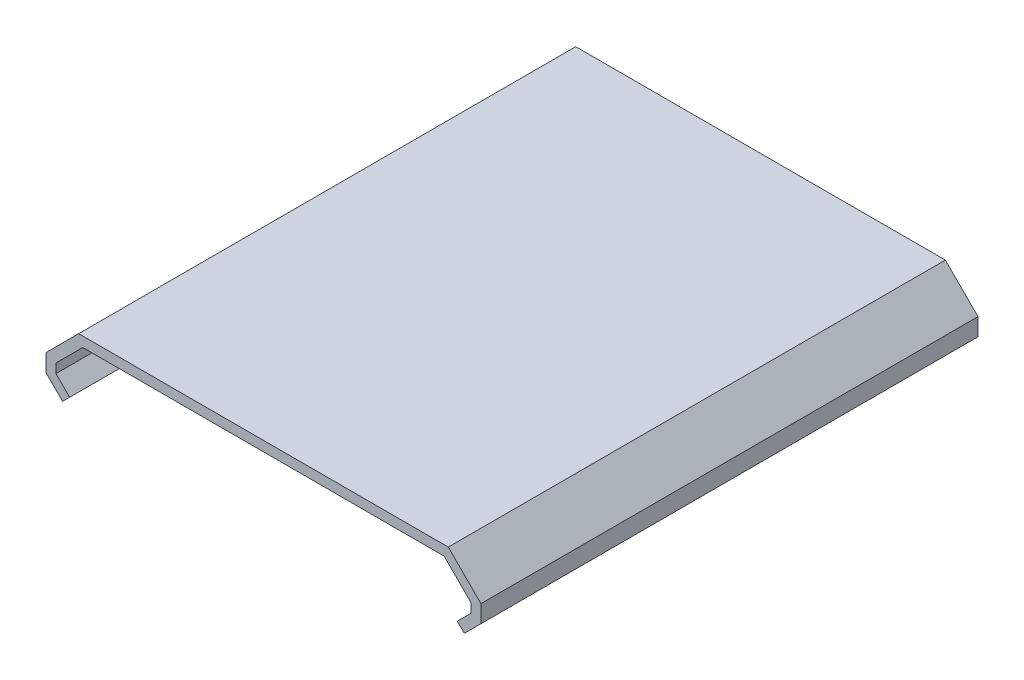
ISO-10303-21;
HEADER;
FILE_DESCRIPTION(('STEP AP214'),'2;1');
FILE_NAME('part.step','',(''),(''),'','','');
FILE_SCHEMA(('AUTOMOTIVE_DESIGN { 1 0 10303 214 1 1 1 1 }'));
ENDSEC;
DATA;
#1=APPLICATION_CONTEXT('core data for automotive mechanical design processes');
#2=APPLICATION_PROTOCOL_DEFINITION('international standard','automotive_design',2000,#1);
#3=PRODUCT_CONTEXT('',#1,'mechanical');
#4=PRODUCT('Part','Part','',(#3));
#5=PRODUCT_RELATED_PRODUCT_CATEGORY('part','',(#4));
#6=PRODUCT_DEFINITION_FORMATION('','',#4);
#7=PRODUCT_DEFINITION_CONTEXT('part definition',#1,'design');
#8=PRODUCT_DEFINITION('design','',#6,#7);
#9=PRODUCT_DEFINITION_SHAPE('','',#8);
#10=(LENGTH_UNIT() NAMED_UNIT(*) SI_UNIT(.MILLI.,.METRE.));
#11=(NAMED_UNIT(*) PLANE_ANGLE_UNIT() SI_UNIT($,.RADIAN.));
#12=(NAMED_UNIT(*) SI_UNIT($,.STERADIAN.) SOLID_ANGLE_UNIT());
#13=UNCERTAINTY_MEASURE_WITH_UNIT(LENGTH_MEASURE(1.E-05),#10,'distance_accuracy_value','');
#14=(GEOMETRIC_REPRESENTATION_CONTEXT(3) GLOBAL_UNCERTAINTY_ASSIGNED_CONTEXT((#13)) GLOBAL_UNIT_ASSIGNED_CONTEXT((#10,
#11,#12)) REPRESENTATION_CONTEXT('',''));
#15=CARTESIAN_POINT('',(0.,0.,0.));
#16=DIRECTION('',(0.,0.,1.));
#17=DIRECTION('',(1.,0.,0.));
#18=AXIS2_PLACEMENT_3D('',#15,#16,#17);
#19=CARTESIAN_POINT('',(83.5,37.5,-200.));
#20=DIRECTION('',(-0.707106781186548,0.707106781186548,0.));
#21=DIRECTION('',(-0.707106781186548,-0.707106781186548,0.));
#22=AXIS2_PLACEMENT_3D('',#19,#20,#21);
#23=PLANE('',#22);
#24=DIRECTION('',(-0.707106781186548,-0.707106781186548,0.));
#25=VECTOR('',#24,1.);
#26=CARTESIAN_POINT('',(83.5,37.5,0.));
#27=LINE('',#26,#25);
#28=CARTESIAN_POINT('',(83.5,37.5,0.));
#29=VERTEX_POINT('',#28);
#30=CARTESIAN_POINT('',(78.,32.,0.));
#31=VERTEX_POINT('',#30);
#32=EDGE_CURVE('E196',#29,#31,#27,.T.);
#33=ORIENTED_EDGE('',*,*,#32,.F.);
#34=DIRECTION('',(0.,0.,1.));
#35=VECTOR('',#34,1.);
#36=CARTESIAN_POINT('',(83.5,37.5,-200.));
#37=LINE('',#36,#35);
#38=CARTESIAN_POINT('',(83.5,37.5,-200.));
#39=VERTEX_POINT('',#38);
#40=EDGE_CURVE('E11',#39,#29,#37,.T.);
#41=ORIENTED_EDGE('',*,*,#40,.F.);
#42=DIRECTION('',(-0.707106781186548,-0.707106781186548,0.));
#43=VECTOR('',#42,1.);
#44=CARTESIAN_POINT('',(83.5,37.5,-200.));
#45=LINE('',#44,#43);
#46=CARTESIAN_POINT('',(78.,32.,-200.));
#47=VERTEX_POINT('',#46);
#48=EDGE_CURVE('E198',#39,#47,#45,.T.);
#49=ORIENTED_EDGE('',*,*,#48,.T.);
#50=DIRECTION('',(0.,0.,1.));
#51=VECTOR('',#50,1.);
#52=CARTESIAN_POINT('',(78.,32.,-200.));
#53=LINE('',#52,#51);
#54=EDGE_CURVE('E44',#47,#31,#53,.T.);
#55=ORIENTED_EDGE('',*,*,#54,.T.);
#56=EDGE_LOOP('',(#33,#41,#49,#55));
#57=FACE_BOUND('',#56,.T.);
#58=ADVANCED_FACE('F41',(#57),#23,.T.);
#59=CARTESIAN_POINT('',(83.5,41.2071067811866,-200.));
#60=DIRECTION('',(-1.,0.,0.));
#61=DIRECTION('',(0.,0.,1.));
#62=AXIS2_PLACEMENT_3D('',#59,#60,#61);
#63=PLANE('',#62);
#64=DIRECTION('',(0.,-1.,0.));
#65=VECTOR('',#64,1.);
#66=CARTESIAN_POINT('',(83.5,41.2071067811866,0.));
#67=LINE('',#66,#65);
#68=CARTESIAN_POINT('',(83.5,41.2071067811866,0.));
#69=VERTEX_POINT('',#68);
#70=EDGE_CURVE('E202',#69,#29,#67,.T.);
#71=ORIENTED_EDGE('',*,*,#70,.F.);
#72=DIRECTION('',(0.,0.,1.));
#73=VECTOR('',#72,1.);
#74=CARTESIAN_POINT('',(83.5,41.2071067811866,-200.));
#75=LINE('',#74,#73);
#76=CARTESIAN_POINT('',(83.5,41.2071067811866,-200.));
#77=VERTEX_POINT('',#76);
#78=EDGE_CURVE('E49',#77,#69,#75,.T.);
#79=ORIENTED_EDGE('',*,*,#78,.F.);
#80=DIRECTION('',(0.,-1.,0.));
#81=VECTOR('',#80,1.);
#82=CARTESIAN_POINT('',(83.5,41.2071067811866,-200.));
#83=LINE('',#82,#81);
#84=EDGE_CURVE('E235',#77,#39,#83,.T.);
#85=ORIENTED_EDGE('',*,*,#84,.T.);
#86=ORIENTED_EDGE('',*,*,#40,.T.);
#87=EDGE_LOOP('',(#71,#79,#85,#86));
#88=FACE_BOUND('',#87,.T.);
#89=ADVANCED_FACE('F324',(#88),#63,.T.);
#90=CARTESIAN_POINT('',(72.7071067811865,52.,-200.));
#91=DIRECTION('',(-0.707106781186547,-0.707106781186548,0.));
#92=DIRECTION('',(0.707106781186548,-0.707106781186547,0.));
#93=AXIS2_PLACEMENT_3D('',#90,#91,#92);
#94=PLANE('',#93);
#95=DIRECTION('',(0.707106781186548,-0.707106781186547,0.));
#96=VECTOR('',#95,1.);
#97=CARTESIAN_POINT('',(72.7071067811865,52.,0.));
#98=LINE('',#97,#96);
#99=CARTESIAN_POINT('',(72.7071067811865,52.,0.));
#100=VERTEX_POINT('',#99);
#101=EDGE_CURVE('E271',#100,#69,#98,.T.);
#102=ORIENTED_EDGE('',*,*,#101,.F.);
#103=DIRECTION('',(0.,0.,1.));
#104=VECTOR('',#103,1.);
#105=CARTESIAN_POINT('',(72.7071067811865,52.,-200.));
#106=LINE('',#105,#104);
#107=CARTESIAN_POINT('',(72.7071067811865,52.,-200.));
#108=VERTEX_POINT('',#107);
#109=EDGE_CURVE('E277',#108,#100,#106,.T.);
#110=ORIENTED_EDGE('',*,*,#109,.F.);
#111=DIRECTION('',(0.707106781186548,-0.707106781186547,0.));
#112=VECTOR('',#111,1.);
#113=CARTESIAN_POINT('',(72.7071067811865,52.,-200.));
#114=LINE('',#113,#112);
#115=EDGE_CURVE('E232',#108,#77,#114,.T.);
#116=ORIENTED_EDGE('',*,*,#115,.T.);
#117=ORIENTED_EDGE('',*,*,#78,.T.);
#118=EDGE_LOOP('',(#102,#110,#116,#117));
#119=FACE_BOUND('',#118,.T.);
#120=ADVANCED_FACE('F383',(#119),#94,.T.);
#121=CARTESIAN_POINT('',(72.7071067811865,52.,-200.));
#122=DIRECTION('',(0.,-1.,0.));
#123=DIRECTION('',(0.,0.,-1.));
#124=AXIS2_PLACEMENT_3D('',#121,#122,#123);
#125=PLANE('',#124);
#126=DIRECTION('',(0.,0.,-1.));
#127=VECTOR('',#126,1.);
#128=CARTESIAN_POINT('',(7.98994949366114,52.,-183.));
#129=LINE('',#128,#127);
#130=CARTESIAN_POINT('',(7.98994949366114,52.,-183.));
#131=VERTEX_POINT('',#130);
#132=CARTESIAN_POINT('',(7.98994949366114,52.,-200.));
#133=VERTEX_POINT('',#132);
#134=EDGE_CURVE('E188',#131,#133,#129,.T.);
#135=ORIENTED_EDGE('',*,*,#134,.T.);
#136=DIRECTION('',(1.,0.,0.));
#137=VECTOR('',#136,1.);
#138=CARTESIAN_POINT('',(72.7071067811865,52.,-200.));
#139=LINE('',#138,#137);
#140=EDGE_CURVE('E229',#133,#108,#139,.T.);
#141=ORIENTED_EDGE('',*,*,#140,.T.);
#142=ORIENTED_EDGE('',*,*,#109,.T.);
#143=DIRECTION('',(1.,0.,0.));
#144=VECTOR('',#143,1.);
#145=CARTESIAN_POINT('',(72.7071067811865,52.,0.));
#146=LINE('',#145,#144);
#147=CARTESIAN_POINT('',(-72.7071067811865,52.,0.));
#148=VERTEX_POINT('',#147);
#149=EDGE_CURVE('E268',#148,#100,#146,.T.);
#150=ORIENTED_EDGE('',*,*,#149,.F.);
#151=DIRECTION('',(0.,0.,1.));
#152=VECTOR('',#151,1.);
#153=CARTESIAN_POINT('',(-72.7071067811865,52.,-200.));
#154=LINE('',#153,#152);
#155=CARTESIAN_POINT('',(-72.7071067811865,52.,-200.));
#156=VERTEX_POINT('',#155);
#157=EDGE_CURVE('E279',#156,#148,#154,.T.);
#158=ORIENTED_EDGE('',*,*,#157,.F.);
#159=CARTESIAN_POINT('',(-3.00000000000003,52.,-200.));
#160=VERTEX_POINT('',#159);
#161=EDGE_CURVE('E230',#156,#160,#139,.T.);
#162=ORIENTED_EDGE('',*,*,#161,.T.);
#163=DIRECTION('',(0.,0.,-1.));
#164=VECTOR('',#163,1.);
#165=CARTESIAN_POINT('',(-3.00000000000003,52.,-183.));
#166=LINE('',#165,#164);
#167=CARTESIAN_POINT('',(-3.00000000000003,52.,-183.));
#168=VERTEX_POINT('',#167);
#169=EDGE_CURVE('E57',#168,#160,#166,.T.);
#170=ORIENTED_EDGE('',*,*,#169,.F.);
#171=DIRECTION('',(1.,0.,0.));
#172=VECTOR('',#171,1.);
#173=CARTESIAN_POINT('',(7.98994949366114,52.,-183.));
#174=LINE('',#173,#172);
#175=EDGE_CURVE('E62',#168,#131,#174,.T.);
#176=ORIENTED_EDGE('',*,*,#175,.T.);
#177=EDGE_LOOP('',(#135,#141,#142,#150,#158,#162,#170,#176));
#178=FACE_BOUND('',#177,.T.);
#179=ADVANCED_FACE('F380',(#178),#125,.T.);
#180=CARTESIAN_POINT('',(-72.7071067811865,52.,-200.));
#181=DIRECTION('',(0.707106781186547,-0.707106781186548,0.));
#182=DIRECTION('',(0.707106781186548,0.707106781186547,0.));
#183=AXIS2_PLACEMENT_3D('',#180,#181,#182);
#184=PLANE('',#183);
#185=DIRECTION('',(0.707106781186548,0.707106781186547,0.));
#186=VECTOR('',#185,1.);
#187=CARTESIAN_POINT('',(-72.7071067811865,52.,0.));
#188=LINE('',#187,#186);
#189=CARTESIAN_POINT('',(-83.5,41.2071067811866,0.));
#190=VERTEX_POINT('',#189);
#191=EDGE_CURVE('E265',#190,#148,#188,.T.);
#192=ORIENTED_EDGE('',*,*,#191,.F.);
#193=DIRECTION('',(0.,0.,1.));
#194=VECTOR('',#193,1.);
#195=CARTESIAN_POINT('',(-83.5,41.2071067811866,-200.));
#196=LINE('',#195,#194);
#197=CARTESIAN_POINT('',(-83.5,41.2071067811866,-200.));
#198=VERTEX_POINT('',#197);
#199=EDGE_CURVE('E281',#198,#190,#196,.T.);
#200=ORIENTED_EDGE('',*,*,#199,.F.);
#201=DIRECTION('',(0.707106781186548,0.707106781186547,0.));
#202=VECTOR('',#201,1.);
#203=CARTESIAN_POINT('',(-72.7071067811865,52.,-200.));
#204=LINE('',#203,#202);
#205=EDGE_CURVE('E226',#198,#156,#204,.T.);
#206=ORIENTED_EDGE('',*,*,#205,.T.);
#207=ORIENTED_EDGE('',*,*,#157,.T.);
#208=EDGE_LOOP('',(#192,#200,#206,#207));
#209=FACE_BOUND('',#208,.T.);
#210=ADVANCED_FACE('F377',(#209),#184,.T.);
#211=CARTESIAN_POINT('',(-83.5,41.2071067811866,-200.));
#212=DIRECTION('',(1.,0.,0.));
#213=DIRECTION('',(0.,0.,-1.));
#214=AXIS2_PLACEMENT_3D('',#211,#212,#213);
#215=PLANE('',#214);
#216=DIRECTION('',(0.,1.,0.));
#217=VECTOR('',#216,1.);
#218=CARTESIAN_POINT('',(-83.5,41.2071067811866,0.));
#219=LINE('',#218,#217);
#220=CARTESIAN_POINT('',(-83.5,37.5,0.));
#221=VERTEX_POINT('',#220);
#222=EDGE_CURVE('E262',#221,#190,#219,.T.);
#223=ORIENTED_EDGE('',*,*,#222,.F.);
#224=DIRECTION('',(0.,0.,1.));
#225=VECTOR('',#224,1.);
#226=CARTESIAN_POINT('',(-83.5,37.5,-200.));
#227=LINE('',#226,#225);
#228=CARTESIAN_POINT('',(-83.5,37.5,-200.));
#229=VERTEX_POINT('',#228);
#230=EDGE_CURVE('E283',#229,#221,#227,.T.);
#231=ORIENTED_EDGE('',*,*,#230,.F.);
#232=DIRECTION('',(0.,1.,0.));
#233=VECTOR('',#232,1.);
#234=CARTESIAN_POINT('',(-83.5,41.2071067811866,-200.));
#235=LINE('',#234,#233);
#236=EDGE_CURVE('E223',#229,#198,#235,.T.);
#237=ORIENTED_EDGE('',*,*,#236,.T.);
#238=ORIENTED_EDGE('',*,*,#199,.T.);
#239=EDGE_LOOP('',(#223,#231,#237,#238));
#240=FACE_BOUND('',#239,.T.);
#241=ADVANCED_FACE('F373',(#240),#215,.T.);
#242=CARTESIAN_POINT('',(-83.5,37.5,-200.));
#243=DIRECTION('',(0.707106781186548,0.707106781186548,0.));
#244=DIRECTION('',(-0.707106781186548,0.707106781186548,0.));
#245=AXIS2_PLACEMENT_3D('',#242,#243,#244);
#246=PLANE('',#245);
#247=DIRECTION('',(-0.707106781186548,0.707106781186548,0.));
#248=VECTOR('',#247,1.);
#249=CARTESIAN_POINT('',(-83.5,37.5,0.));
#250=LINE('',#249,#248);
#251=CARTESIAN_POINT('',(-78.,32.,0.));
#252=VERTEX_POINT('',#251);
#253=EDGE_CURVE('E259',#252,#221,#250,.T.);
#254=ORIENTED_EDGE('',*,*,#253,.F.);
#255=DIRECTION('',(0.,0.,1.));
#256=VECTOR('',#255,1.);
#257=CARTESIAN_POINT('',(-78.,32.,-200.));
#258=LINE('',#257,#256);
#259=CARTESIAN_POINT('',(-78.,32.,-200.));
#260=VERTEX_POINT('',#259);
#261=EDGE_CURVE('E285',#260,#252,#258,.T.);
#262=ORIENTED_EDGE('',*,*,#261,.F.);
#263=DIRECTION('',(-0.707106781186548,0.707106781186548,0.));
#264=VECTOR('',#263,1.);
#265=CARTESIAN_POINT('',(-83.5,37.5,-200.));
#266=LINE('',#265,#264);
#267=EDGE_CURVE('E220',#260,#229,#266,.T.);
#268=ORIENTED_EDGE('',*,*,#267,.T.);
#269=ORIENTED_EDGE('',*,*,#230,.T.);
#270=EDGE_LOOP('',(#254,#262,#268,#269));
#271=FACE_BOUND('',#270,.T.);
#272=ADVANCED_FACE('F367',(#271),#246,.T.);
#273=CARTESIAN_POINT('',(-78.,32.,-200.));
#274=DIRECTION('',(-0.707106781186547,0.707106781186548,0.));
#275=DIRECTION('',(-0.707106781186548,-0.707106781186547,0.));
#276=AXIS2_PLACEMENT_3D('',#273,#274,#275);
#277=PLANE('',#276);
#278=DIRECTION('',(-0.707106781186548,-0.707106781186547,0.));
#279=VECTOR('',#278,1.);
#280=CARTESIAN_POINT('',(-78.,32.,0.));
#281=LINE('',#280,#279);
#282=CARTESIAN_POINT('',(-80.8284271247462,29.1715728752538,0.));
#283=VERTEX_POINT('',#282);
#284=EDGE_CURVE('E257',#252,#283,#281,.T.);
#285=ORIENTED_EDGE('',*,*,#284,.T.);
#286=DIRECTION('',(0.,0.,1.));
#287=VECTOR('',#286,1.);
#288=CARTESIAN_POINT('',(-80.8284271247462,29.1715728752538,-200.));
#289=LINE('',#288,#287);
#290=CARTESIAN_POINT('',(-80.8284271247462,29.1715728752538,-200.));
#291=VERTEX_POINT('',#290);
#292=EDGE_CURVE('E287',#291,#283,#289,.T.);
#293=ORIENTED_EDGE('',*,*,#292,.F.);
#294=DIRECTION('',(-0.707106781186548,-0.707106781186547,0.));
#295=VECTOR('',#294,1.);
#296=CARTESIAN_POINT('',(-78.,32.,-200.));
#297=LINE('',#296,#295);
#298=EDGE_CURVE('E218',#260,#291,#297,.T.);
#299=ORIENTED_EDGE('',*,*,#298,.F.);
#300=ORIENTED_EDGE('',*,*,#261,.T.);
#301=EDGE_LOOP('',(#285,#293,#299,#300));
#302=FACE_BOUND('',#301,.T.);
#303=ADVANCED_FACE('F384',(#302),#277,.F.);
#304=CARTESIAN_POINT('',(-86.3284271247462,34.6715728752538,-200.));
#305=DIRECTION('',(0.707106781186548,0.707106781186548,0.));
#306=DIRECTION('',(-0.707106781186548,0.707106781186548,0.));
#307=AXIS2_PLACEMENT_3D('',#304,#305,#306);
#308=PLANE('',#307);
#309=DIRECTION('',(-0.707106781186548,0.707106781186548,0.));
#310=VECTOR('',#309,1.);
#311=CARTESIAN_POINT('',(-86.3284271247462,34.6715728752538,0.));
#312=LINE('',#311,#310);
#313=CARTESIAN_POINT('',(-87.5,35.8431457505076,0.));
#314=VERTEX_POINT('',#313);
#315=EDGE_CURVE('E255',#283,#314,#312,.T.);
#316=ORIENTED_EDGE('',*,*,#315,.T.);
#317=DIRECTION('',(0.,0.,1.));
#318=VECTOR('',#317,1.);
#319=CARTESIAN_POINT('',(-87.5,35.8431457505076,-200.));
#320=LINE('',#319,#318);
#321=CARTESIAN_POINT('',(-87.5,35.8431457505076,-200.));
#322=VERTEX_POINT('',#321);
#323=EDGE_CURVE('E290',#322,#314,#320,.T.);
#324=ORIENTED_EDGE('',*,*,#323,.F.);
#325=DIRECTION('',(-0.707106781186548,0.707106781186548,0.));
#326=VECTOR('',#325,1.);
#327=CARTESIAN_POINT('',(-86.3284271247462,34.6715728752538,-200.));
#328=LINE('',#327,#326);
#329=EDGE_CURVE('E216',#291,#322,#328,.T.);
#330=ORIENTED_EDGE('',*,*,#329,.F.);
#331=ORIENTED_EDGE('',*,*,#292,.T.);
#332=EDGE_LOOP('',(#316,#324,#330,#331));
#333=FACE_BOUND('',#332,.T.);
#334=ADVANCED_FACE('F361',(#333),#308,.F.);
#335=CARTESIAN_POINT('',(-87.5,41.2071067811866,-200.));
#336=DIRECTION('',(1.,0.,0.));
#337=DIRECTION('',(0.,0.,-1.));
#338=AXIS2_PLACEMENT_3D('',#335,#336,#337);
#339=PLANE('',#338);
#340=DIRECTION('',(0.,1.,0.));
#341=VECTOR('',#340,1.);
#342=CARTESIAN_POINT('',(-87.5,41.2071067811866,0.));
#343=LINE('',#342,#341);
#344=CARTESIAN_POINT('',(-87.5,42.863961030679,0.));
#345=VERTEX_POINT('',#344);
#346=EDGE_CURVE('E253',#314,#345,#343,.T.);
#347=ORIENTED_EDGE('',*,*,#346,.T.);
#348=DIRECTION('',(0.,0.,1.));
#349=VECTOR('',#348,1.);
#350=CARTESIAN_POINT('',(-87.5,42.863961030679,-200.));
#351=LINE('',#350,#349);
#352=CARTESIAN_POINT('',(-87.5,42.863961030679,-200.));
#353=VERTEX_POINT('',#352);
#354=EDGE_CURVE('E293',#353,#345,#351,.T.);
#355=ORIENTED_EDGE('',*,*,#354,.F.);
#356=DIRECTION('',(0.,1.,0.));
#357=VECTOR('',#356,1.);
#358=CARTESIAN_POINT('',(-87.5,41.2071067811866,-200.));
#359=LINE('',#358,#357);
#360=EDGE_CURVE('E214',#322,#353,#359,.T.);
#361=ORIENTED_EDGE('',*,*,#360,.F.);
#362=ORIENTED_EDGE('',*,*,#323,.T.);
#363=EDGE_LOOP('',(#347,#355,#361,#362));
#364=FACE_BOUND('',#363,.T.);
#365=ADVANCED_FACE('F357',(#364),#339,.F.);
#366=CARTESIAN_POINT('',(-75.5355339059327,54.8284271247462,-200.));
#367=DIRECTION('',(0.707106781186547,-0.707106781186548,0.));
#368=DIRECTION('',(0.707106781186548,0.707106781186547,0.));
#369=AXIS2_PLACEMENT_3D('',#366,#367,#368);
#370=PLANE('',#369);
#371=DIRECTION('',(0.707106781186548,0.707106781186547,0.));
#372=VECTOR('',#371,1.);
#373=CARTESIAN_POINT('',(-75.5355339059327,54.8284271247462,0.));
#374=LINE('',#373,#372);
#375=CARTESIAN_POINT('',(-74.3639610306789,56.,0.));
#376=VERTEX_POINT('',#375);
#377=EDGE_CURVE('E251',#345,#376,#374,.T.);
#378=ORIENTED_EDGE('',*,*,#377,.T.);
#379=DIRECTION('',(0.,0.,1.));
#380=VECTOR('',#379,1.);
#381=CARTESIAN_POINT('',(-74.3639610306789,56.,-200.));
#382=LINE('',#381,#380);
#383=CARTESIAN_POINT('',(-74.3639610306789,56.,-200.));
#384=VERTEX_POINT('',#383);
#385=EDGE_CURVE('E296',#384,#376,#382,.T.);
#386=ORIENTED_EDGE('',*,*,#385,.F.);
#387=DIRECTION('',(0.707106781186548,0.707106781186547,0.));
#388=VECTOR('',#387,1.);
#389=CARTESIAN_POINT('',(-75.5355339059327,54.8284271247462,-200.));
#390=LINE('',#389,#388);
#391=EDGE_CURVE('E212',#353,#384,#390,.T.);
#392=ORIENTED_EDGE('',*,*,#391,.F.);
#393=ORIENTED_EDGE('',*,*,#354,.T.);
#394=EDGE_LOOP('',(#378,#386,#392,#393));
#395=FACE_BOUND('',#394,.T.);
#396=ADVANCED_FACE('F352',(#395),#370,.F.);
#397=CARTESIAN_POINT('',(72.7071067811865,56.,-200.));
#398=DIRECTION('',(0.,-1.,0.));
#399=DIRECTION('',(0.,0.,-1.));
#400=AXIS2_PLACEMENT_3D('',#397,#398,#399);
#401=PLANE('',#400);
#402=DIRECTION('',(1.,0.,0.));
#403=VECTOR('',#402,1.);
#404=CARTESIAN_POINT('',(72.7071067811865,56.,0.));
#405=LINE('',#404,#403);
#406=CARTESIAN_POINT('',(74.3639610306789,56.,0.));
#407=VERTEX_POINT('',#406);
#408=EDGE_CURVE('E249',#376,#407,#405,.T.);
#409=ORIENTED_EDGE('',*,*,#408,.T.);
#410=DIRECTION('',(0.,0.,1.));
#411=VECTOR('',#410,1.);
#412=CARTESIAN_POINT('',(74.3639610306789,56.,-200.));
#413=LINE('',#412,#411);
#414=CARTESIAN_POINT('',(74.3639610306789,56.,-200.));
#415=VERTEX_POINT('',#414);
#416=EDGE_CURVE('E299',#415,#407,#413,.T.);
#417=ORIENTED_EDGE('',*,*,#416,.F.);
#418=DIRECTION('',(1.,0.,0.));
#419=VECTOR('',#418,1.);
#420=CARTESIAN_POINT('',(72.7071067811865,56.,-200.));
#421=LINE('',#420,#419);
#422=EDGE_CURVE('E210',#384,#415,#421,.T.);
#423=ORIENTED_EDGE('',*,*,#422,.F.);
#424=ORIENTED_EDGE('',*,*,#385,.T.);
#425=EDGE_LOOP('',(#409,#417,#423,#424));
#426=FACE_BOUND('',#425,.T.);
#427=ADVANCED_FACE('F346',(#426),#401,.F.);
#428=CARTESIAN_POINT('',(75.5355339059327,54.8284271247462,-200.));
#429=DIRECTION('',(-0.707106781186547,-0.707106781186548,0.));
#430=DIRECTION('',(0.707106781186548,-0.707106781186547,0.));
#431=AXIS2_PLACEMENT_3D('',#428,#429,#430);
#432=PLANE('',#431);
#433=DIRECTION('',(0.707106781186548,-0.707106781186547,0.));
#434=VECTOR('',#433,1.);
#435=CARTESIAN_POINT('',(75.5355339059327,54.8284271247462,0.));
#436=LINE('',#435,#434);
#437=CARTESIAN_POINT('',(87.5,42.863961030679,0.));
#438=VERTEX_POINT('',#437);
#439=EDGE_CURVE('E247',#407,#438,#436,.T.);
#440=ORIENTED_EDGE('',*,*,#439,.T.);
#441=DIRECTION('',(0.,0.,1.));
#442=VECTOR('',#441,1.);
#443=CARTESIAN_POINT('',(87.5,42.863961030679,-200.));
#444=LINE('',#443,#442);
#445=CARTESIAN_POINT('',(87.5,42.863961030679,-200.));
#446=VERTEX_POINT('',#445);
#447=EDGE_CURVE('E302',#446,#438,#444,.T.);
#448=ORIENTED_EDGE('',*,*,#447,.F.);
#449=DIRECTION('',(0.707106781186548,-0.707106781186547,0.));
#450=VECTOR('',#449,1.);
#451=CARTESIAN_POINT('',(75.5355339059327,54.8284271247462,-200.));
#452=LINE('',#451,#450);
#453=EDGE_CURVE('E208',#415,#446,#452,.T.);
#454=ORIENTED_EDGE('',*,*,#453,.F.);
#455=ORIENTED_EDGE('',*,*,#416,.T.);
#456=EDGE_LOOP('',(#440,#448,#454,#455));
#457=FACE_BOUND('',#456,.T.);
#458=ADVANCED_FACE('F342',(#457),#432,.F.);
#459=CARTESIAN_POINT('',(87.5,41.2071067811866,-200.));
#460=DIRECTION('',(-1.,0.,0.));
#461=DIRECTION('',(0.,0.,1.));
#462=AXIS2_PLACEMENT_3D('',#459,#460,#461);
#463=PLANE('',#462);
#464=DIRECTION('',(0.,1.,0.));
#465=VECTOR('',#464,1.);
#466=CARTESIAN_POINT('',(87.5,41.2071067811866,0.));
#467=LINE('',#466,#465);
#468=CARTESIAN_POINT('',(87.5,35.8431457505076,0.));
#469=VERTEX_POINT('',#468);
#470=EDGE_CURVE('E245',#438,#469,#467,.F.);
#471=ORIENTED_EDGE('',*,*,#470,.T.);
#472=DIRECTION('',(0.,0.,1.));
#473=VECTOR('',#472,1.);
#474=CARTESIAN_POINT('',(87.5,35.8431457505076,-200.));
#475=LINE('',#474,#473);
#476=CARTESIAN_POINT('',(87.5,35.8431457505076,-200.));
#477=VERTEX_POINT('',#476);
#478=EDGE_CURVE('E305',#477,#469,#475,.T.);
#479=ORIENTED_EDGE('',*,*,#478,.F.);
#480=DIRECTION('',(0.,1.,0.));
#481=VECTOR('',#480,1.);
#482=CARTESIAN_POINT('',(87.5,41.2071067811866,-200.));
#483=LINE('',#482,#481);
#484=EDGE_CURVE('E206',#446,#477,#483,.F.);
#485=ORIENTED_EDGE('',*,*,#484,.F.);
#486=ORIENTED_EDGE('',*,*,#447,.T.);
#487=EDGE_LOOP('',(#471,#479,#485,#486));
#488=FACE_BOUND('',#487,.T.);
#489=ADVANCED_FACE('F338',(#488),#463,.F.);
#490=CARTESIAN_POINT('',(86.3284271247462,34.6715728752538,-200.));
#491=DIRECTION('',(-0.707106781186548,0.707106781186548,0.));
#492=DIRECTION('',(-0.707106781186548,-0.707106781186548,0.));
#493=AXIS2_PLACEMENT_3D('',#490,#491,#492);
#494=PLANE('',#493);
#495=DIRECTION('',(-0.707106781186548,-0.707106781186548,0.));
#496=VECTOR('',#495,1.);
#497=CARTESIAN_POINT('',(86.3284271247462,34.6715728752538,0.));
#498=LINE('',#497,#496);
#499=CARTESIAN_POINT('',(80.8284271247462,29.1715728752538,0.));
#500=VERTEX_POINT('',#499);
#501=EDGE_CURVE('E243',#469,#500,#498,.T.);
#502=ORIENTED_EDGE('',*,*,#501,.T.);
#503=DIRECTION('',(0.,0.,1.));
#504=VECTOR('',#503,1.);
#505=CARTESIAN_POINT('',(80.8284271247462,29.1715728752538,-200.));
#506=LINE('',#505,#504);
#507=CARTESIAN_POINT('',(80.8284271247462,29.1715728752538,-200.));
#508=VERTEX_POINT('',#507);
#509=EDGE_CURVE('E307',#508,#500,#506,.T.);
#510=ORIENTED_EDGE('',*,*,#509,.F.);
#511=DIRECTION('',(-0.707106781186548,-0.707106781186548,0.));
#512=VECTOR('',#511,1.);
#513=CARTESIAN_POINT('',(86.3284271247462,34.6715728752538,-200.));
#514=LINE('',#513,#512);
#515=EDGE_CURVE('E204',#477,#508,#514,.T.);
#516=ORIENTED_EDGE('',*,*,#515,.F.);
#517=ORIENTED_EDGE('',*,*,#478,.T.);
#518=EDGE_LOOP('',(#502,#510,#516,#517));
#519=FACE_BOUND('',#518,.T.);
#520=ADVANCED_FACE('F333',(#519),#494,.F.);
#521=CARTESIAN_POINT('',(80.8284271247462,29.1715728752538,-200.));
#522=DIRECTION('',(0.707106781186547,0.707106781186548,0.));
#523=DIRECTION('',(-0.707106781186548,0.707106781186547,0.));
#524=AXIS2_PLACEMENT_3D('',#521,#522,#523);
#525=PLANE('',#524);
#526=DIRECTION('',(-0.707106781186548,0.707106781186547,0.));
#527=VECTOR('',#526,1.);
#528=CARTESIAN_POINT('',(80.8284271247462,29.1715728752538,0.));
#529=LINE('',#528,#527);
#530=EDGE_CURVE('E240',#500,#31,#529,.T.);
#531=ORIENTED_EDGE('',*,*,#530,.T.);
#532=ORIENTED_EDGE('',*,*,#54,.F.);
#533=DIRECTION('',(-0.707106781186548,0.707106781186547,0.));
#534=VECTOR('',#533,1.);
#535=CARTESIAN_POINT('',(80.8284271247462,29.1715728752538,-200.));
#536=LINE('',#535,#534);
#537=EDGE_CURVE('E201',#508,#47,#536,.T.);
#538=ORIENTED_EDGE('',*,*,#537,.F.);
#539=ORIENTED_EDGE('',*,*,#509,.T.);
#540=EDGE_LOOP('',(#531,#532,#538,#539));
#541=FACE_BOUND('',#540,.T.);
#542=ADVANCED_FACE('F317',(#541),#525,.F.);
#543=CARTESIAN_POINT('',(0.,0.,-200.));
#544=DIRECTION('',(0.,0.,-1.));
#545=DIRECTION('',(-1.,0.,0.));
#546=AXIS2_PLACEMENT_3D('',#543,#544,#545);
#547=PLANE('',#546);
#548=ORIENTED_EDGE('',*,*,#48,.F.);
#549=ORIENTED_EDGE('',*,*,#84,.F.);
#550=ORIENTED_EDGE('',*,*,#115,.F.);
#551=ORIENTED_EDGE('',*,*,#140,.F.);
#552=DIRECTION('',(-0.707106781186547,-0.707106781186547,0.));
#553=VECTOR('',#552,1.);
#554=CARTESIAN_POINT('',(-3.00000000000003,41.0100505063389,-200.));
#555=LINE('',#554,#553);
#556=CARTESIAN_POINT('',(-3.00000000000003,41.0100505063389,-200.));
#557=VERTEX_POINT('',#556);
#558=EDGE_CURVE('E190',#133,#557,#555,.T.);
#559=ORIENTED_EDGE('',*,*,#558,.T.);
#560=DIRECTION('',(0.,1.,0.));
#561=VECTOR('',#560,1.);
#562=CARTESIAN_POINT('',(-3.00000000000003,52.,-200.));
#563=LINE('',#562,#561);
#564=EDGE_CURVE('E176',#557,#160,#563,.T.);
#565=ORIENTED_EDGE('',*,*,#564,.T.);
#566=ORIENTED_EDGE('',*,*,#161,.F.);
#567=ORIENTED_EDGE('',*,*,#205,.F.);
#568=ORIENTED_EDGE('',*,*,#236,.F.);
#569=ORIENTED_EDGE('',*,*,#267,.F.);
#570=ORIENTED_EDGE('',*,*,#298,.T.);
#571=ORIENTED_EDGE('',*,*,#329,.T.);
#572=ORIENTED_EDGE('',*,*,#360,.T.);
#573=ORIENTED_EDGE('',*,*,#391,.T.);
#574=ORIENTED_EDGE('',*,*,#422,.T.);
#575=ORIENTED_EDGE('',*,*,#453,.T.);
#576=ORIENTED_EDGE('',*,*,#484,.T.);
#577=ORIENTED_EDGE('',*,*,#515,.T.);
#578=ORIENTED_EDGE('',*,*,#537,.T.);
#579=EDGE_LOOP('',(#548,#549,#550,#551,#559,#565,#566,#567,#568,#569,#570,#571,#572,#573,#574,
#575,#576,#577,#578));
#580=FACE_BOUND('',#579,.T.);
#581=ADVANCED_FACE('F327',(#580),#547,.T.);
#582=CARTESIAN_POINT('',(0.,0.,0.));
#583=DIRECTION('',(0.,0.,-1.));
#584=DIRECTION('',(-1.,0.,0.));
#585=AXIS2_PLACEMENT_3D('',#582,#583,#584);
#586=PLANE('',#585);
#587=ORIENTED_EDGE('',*,*,#32,.T.);
#588=ORIENTED_EDGE('',*,*,#530,.F.);
#589=ORIENTED_EDGE('',*,*,#501,.F.);
#590=ORIENTED_EDGE('',*,*,#470,.F.);
#591=ORIENTED_EDGE('',*,*,#439,.F.);
#592=ORIENTED_EDGE('',*,*,#408,.F.);
#593=ORIENTED_EDGE('',*,*,#377,.F.);
#594=ORIENTED_EDGE('',*,*,#346,.F.);
#595=ORIENTED_EDGE('',*,*,#315,.F.);
#596=ORIENTED_EDGE('',*,*,#284,.F.);
#597=ORIENTED_EDGE('',*,*,#253,.T.);
#598=ORIENTED_EDGE('',*,*,#222,.T.);
#599=ORIENTED_EDGE('',*,*,#191,.T.);
#600=ORIENTED_EDGE('',*,*,#149,.T.);
#601=ORIENTED_EDGE('',*,*,#101,.T.);
#602=ORIENTED_EDGE('',*,*,#70,.T.);
#603=EDGE_LOOP('',(#587,#588,#589,#590,#591,#592,#593,#594,#595,#596,#597,#598,#599,#600,#601,#602));
#604=FACE_BOUND('',#603,.T.);
#605=ADVANCED_FACE('F320',(#604),#586,.F.);
#606=CARTESIAN_POINT('',(-3.00000000000003,41.0100505063389,-183.));
#607=DIRECTION('',(0.707106781186548,-0.707106781186548,0.));
#608=DIRECTION('',(0.707106781186548,0.707106781186548,0.));
#609=AXIS2_PLACEMENT_3D('',#606,#607,#608);
#610=PLANE('',#609);
#611=ORIENTED_EDGE('',*,*,#558,.F.);
#612=ORIENTED_EDGE('',*,*,#134,.F.);
#613=DIRECTION('',(-0.707106781186547,-0.707106781186547,0.));
#614=VECTOR('',#613,1.);
#615=CARTESIAN_POINT('',(-3.00000000000003,41.0100505063389,-183.));
#616=LINE('',#615,#614);
#617=CARTESIAN_POINT('',(-3.00000000000003,41.0100505063389,-183.));
#618=VERTEX_POINT('',#617);
#619=EDGE_CURVE('E185',#131,#618,#616,.T.);
#620=ORIENTED_EDGE('',*,*,#619,.T.);
#621=DIRECTION('',(0.,0.,-1.));
#622=VECTOR('',#621,1.);
#623=CARTESIAN_POINT('',(-3.00000000000003,41.0100505063389,-183.));
#624=LINE('',#623,#622);
#625=EDGE_CURVE('E171',#618,#557,#624,.T.);
#626=ORIENTED_EDGE('',*,*,#625,.T.);
#627=EDGE_LOOP('',(#611,#612,#620,#626));
#628=FACE_BOUND('',#627,.T.);
#629=ADVANCED_FACE('F187',(#628),#610,.T.);
#630=CARTESIAN_POINT('',(-3.00000000000003,52.,-183.));
#631=DIRECTION('',(-1.,0.,0.));
#632=DIRECTION('',(0.,-1.,0.));
#633=AXIS2_PLACEMENT_3D('',#630,#631,#632);
#634=PLANE('',#633);
#635=ORIENTED_EDGE('',*,*,#564,.F.);
#636=ORIENTED_EDGE('',*,*,#625,.F.);
#637=DIRECTION('',(0.,1.,0.));
#638=VECTOR('',#637,1.);
#639=CARTESIAN_POINT('',(-3.00000000000003,52.,-183.));
#640=LINE('',#639,#638);
#641=EDGE_CURVE('E174',#618,#168,#640,.T.);
#642=ORIENTED_EDGE('',*,*,#641,.T.);
#643=ORIENTED_EDGE('',*,*,#169,.T.);
#644=EDGE_LOOP('',(#635,#636,#642,#643));
#645=FACE_BOUND('',#644,.T.);
#646=ADVANCED_FACE('F173',(#645),#634,.T.);
#647=CARTESIAN_POINT('',(0.,0.,-183.));
#648=DIRECTION('',(0.,0.,1.));
#649=DIRECTION('',(1.,0.,0.));
#650=AXIS2_PLACEMENT_3D('',#647,#648,#649);
#651=PLANE('',#650);
#652=ORIENTED_EDGE('',*,*,#619,.F.);
#653=ORIENTED_EDGE('',*,*,#175,.F.);
#654=ORIENTED_EDGE('',*,*,#641,.F.);
#655=EDGE_LOOP('',(#652,#653,#654));
#656=FACE_BOUND('',#655,.T.);
#657=ADVANCED_FACE('F184',(#656),#651,.T.);
#658=CLOSED_SHELL('',(#58,#89,#120,#179,#210,#241,#272,#303,#334,#365,#396,#427,#458,#489,#520,
#542,#581,#605,#629,#646,#657));
#659=MANIFOLD_SOLID_BREP('B2',#658);
#660=ADVANCED_BREP_SHAPE_REPRESENTATION('',(#18,#659),#14);
#661=SHAPE_DEFINITION_REPRESENTATION(#9,#660);
ENDSEC;
END-ISO-10303-21;
